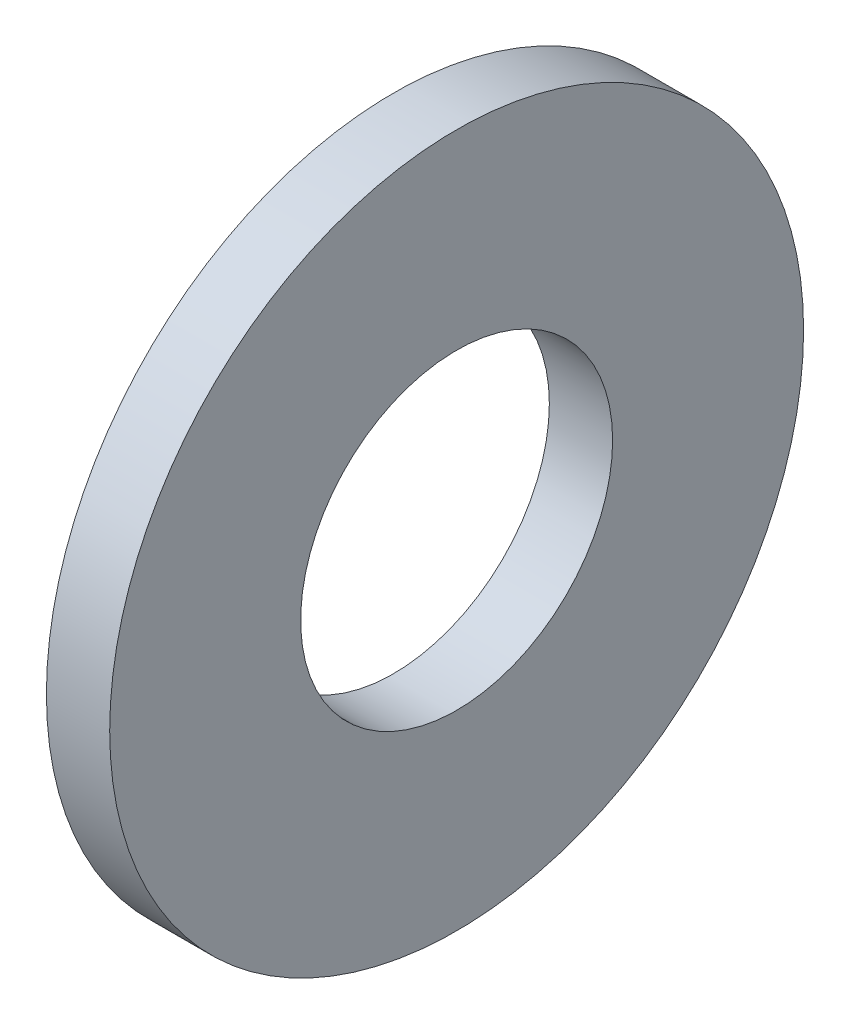
ISO-10303-21;
HEADER;
FILE_DESCRIPTION(('STEP AP214'),'2;1');
FILE_NAME('part.step','',(''),(''),'','','');
FILE_SCHEMA(('AUTOMOTIVE_DESIGN { 1 0 10303 214 1 1 1 1 }'));
ENDSEC;
DATA;
#1=APPLICATION_CONTEXT('core data for automotive mechanical design processes');
#2=APPLICATION_PROTOCOL_DEFINITION('international standard','automotive_design',2000,#1);
#3=PRODUCT_CONTEXT('',#1,'mechanical');
#4=PRODUCT('Part','Part','',(#3));
#5=PRODUCT_RELATED_PRODUCT_CATEGORY('part','',(#4));
#6=PRODUCT_DEFINITION_FORMATION('','',#4);
#7=PRODUCT_DEFINITION_CONTEXT('part definition',#1,'design');
#8=PRODUCT_DEFINITION('design','',#6,#7);
#9=PRODUCT_DEFINITION_SHAPE('','',#8);
#10=(LENGTH_UNIT() NAMED_UNIT(*) SI_UNIT(.MILLI.,.METRE.));
#11=(NAMED_UNIT(*) PLANE_ANGLE_UNIT() SI_UNIT($,.RADIAN.));
#12=(NAMED_UNIT(*) SI_UNIT($,.STERADIAN.) SOLID_ANGLE_UNIT());
#13=UNCERTAINTY_MEASURE_WITH_UNIT(LENGTH_MEASURE(1.E-05),#10,'distance_accuracy_value','');
#14=(GEOMETRIC_REPRESENTATION_CONTEXT(3) GLOBAL_UNCERTAINTY_ASSIGNED_CONTEXT((#13)) GLOBAL_UNIT_ASSIGNED_CONTEXT((#10,
#11,#12)) REPRESENTATION_CONTEXT('',''));
#15=CARTESIAN_POINT('',(0.,0.,0.));
#16=DIRECTION('',(0.,0.,1.));
#17=DIRECTION('',(1.,0.,0.));
#18=AXIS2_PLACEMENT_3D('',#15,#16,#17);
#19=CARTESIAN_POINT('',(1.4478,0.,0.));
#20=DIRECTION('',(1.,0.,0.));
#21=DIRECTION('',(0.,0.,-1.));
#22=AXIS2_PLACEMENT_3D('',#19,#20,#21);
#23=PLANE('',#22);
#24=CARTESIAN_POINT('',(1.4478,0.,0.));
#25=DIRECTION('',(1.,0.,0.));
#26=DIRECTION('',(0.,0.,-1.));
#27=AXIS2_PLACEMENT_3D('',#24,#25,#26);
#28=CIRCLE('',#27,7.9375);
#29=CARTESIAN_POINT('',(1.4478,0.,-7.9375));
#30=VERTEX_POINT('',#29);
#31=EDGE_CURVE('E10',#30,#30,#28,.T.);
#32=ORIENTED_EDGE('',*,*,#31,.T.);
#33=EDGE_LOOP('',(#32));
#34=FACE_BOUND('',#33,.T.);
#35=CARTESIAN_POINT('',(1.4478,0.,0.));
#36=DIRECTION('',(1.,0.,0.));
#37=DIRECTION('',(0.,0.,-1.));
#38=AXIS2_PLACEMENT_3D('',#35,#36,#37);
#39=CIRCLE('',#38,3.5687);
#40=CARTESIAN_POINT('',(1.4478,0.,-3.5687));
#41=VERTEX_POINT('',#40);
#42=EDGE_CURVE('E42',#41,#41,#39,.T.);
#43=ORIENTED_EDGE('',*,*,#42,.F.);
#44=EDGE_LOOP('',(#43));
#45=FACE_BOUND('',#44,.T.);
#46=ADVANCED_FACE('F31',(#34,#45),#23,.T.);
#47=CARTESIAN_POINT('',(0.,0.,0.));
#48=DIRECTION('',(1.,0.,0.));
#49=DIRECTION('',(0.,0.,-1.));
#50=AXIS2_PLACEMENT_3D('',#47,#48,#49);
#51=PLANE('',#50);
#52=CARTESIAN_POINT('',(0.,0.,0.));
#53=DIRECTION('',(1.,0.,0.));
#54=DIRECTION('',(0.,0.,-1.));
#55=AXIS2_PLACEMENT_3D('',#52,#53,#54);
#56=CIRCLE('',#55,7.9375);
#57=CARTESIAN_POINT('',(0.,0.,-7.9375));
#58=VERTEX_POINT('',#57);
#59=EDGE_CURVE('E35',#58,#58,#56,.T.);
#60=ORIENTED_EDGE('',*,*,#59,.F.);
#61=EDGE_LOOP('',(#60));
#62=FACE_BOUND('',#61,.T.);
#63=CARTESIAN_POINT('',(0.,0.,0.));
#64=DIRECTION('',(1.,0.,0.));
#65=DIRECTION('',(0.,0.,-1.));
#66=AXIS2_PLACEMENT_3D('',#63,#64,#65);
#67=CIRCLE('',#66,3.5687);
#68=CARTESIAN_POINT('',(0.,0.,-3.5687));
#69=VERTEX_POINT('',#68);
#70=EDGE_CURVE('E44',#69,#69,#67,.T.);
#71=ORIENTED_EDGE('',*,*,#70,.T.);
#72=EDGE_LOOP('',(#71));
#73=FACE_BOUND('',#72,.T.);
#74=ADVANCED_FACE('F54',(#62,#73),#51,.F.);
#75=CARTESIAN_POINT('',(1.4478,0.,0.));
#76=DIRECTION('',(-1.,0.,0.));
#77=DIRECTION('',(0.,0.,1.));
#78=AXIS2_PLACEMENT_3D('',#75,#76,#77);
#79=CYLINDRICAL_SURFACE('',#78,7.9375);
#80=ORIENTED_EDGE('',*,*,#31,.F.);
#81=EDGE_LOOP('',(#80));
#82=FACE_BOUND('',#81,.T.);
#83=ORIENTED_EDGE('',*,*,#59,.T.);
#84=EDGE_LOOP('',(#83));
#85=FACE_BOUND('',#84,.T.);
#86=ADVANCED_FACE('F33',(#82,#85),#79,.T.);
#87=CARTESIAN_POINT('',(1.4478,0.,0.));
#88=DIRECTION('',(-1.,0.,0.));
#89=DIRECTION('',(0.,0.,1.));
#90=AXIS2_PLACEMENT_3D('',#87,#88,#89);
#91=CYLINDRICAL_SURFACE('',#90,3.5687);
#92=ORIENTED_EDGE('',*,*,#42,.T.);
#93=EDGE_LOOP('',(#92));
#94=FACE_BOUND('',#93,.T.);
#95=ORIENTED_EDGE('',*,*,#70,.F.);
#96=EDGE_LOOP('',(#95));
#97=FACE_BOUND('',#96,.T.);
#98=ADVANCED_FACE('F50',(#94,#97),#91,.F.);
#99=CLOSED_SHELL('',(#46,#74,#86,#98));
#100=MANIFOLD_SOLID_BREP('B2',#99);
#101=ADVANCED_BREP_SHAPE_REPRESENTATION('',(#18,#100),#14);
#102=SHAPE_DEFINITION_REPRESENTATION(#9,#101);
ENDSEC;
END-ISO-10303-21;
